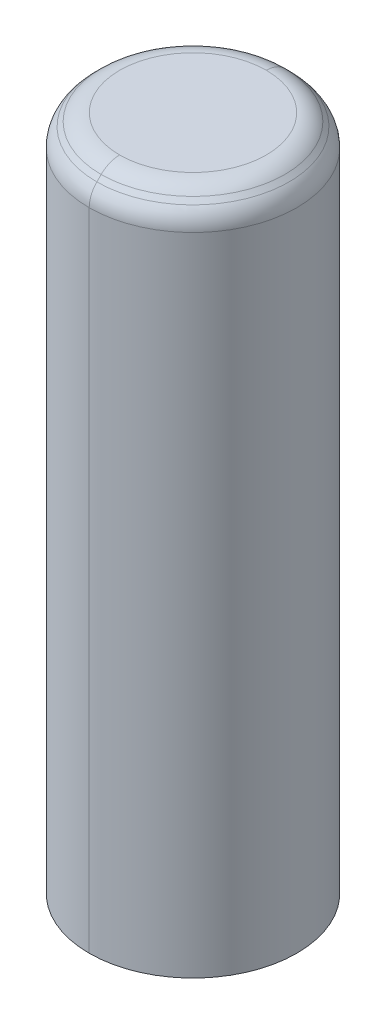
ISO-10303-21;
HEADER;
FILE_DESCRIPTION(('STEP AP214'),'2;1');
FILE_NAME('part.step','',(''),(''),'','','');
FILE_SCHEMA(('AUTOMOTIVE_DESIGN { 1 0 10303 214 1 1 1 1 }'));
ENDSEC;
DATA;
#1=APPLICATION_CONTEXT('core data for automotive mechanical design processes');
#2=APPLICATION_PROTOCOL_DEFINITION('international standard','automotive_design',2000,#1);
#3=PRODUCT_CONTEXT('',#1,'mechanical');
#4=PRODUCT('Part','Part','',(#3));
#5=PRODUCT_RELATED_PRODUCT_CATEGORY('part','',(#4));
#6=PRODUCT_DEFINITION_FORMATION('','',#4);
#7=PRODUCT_DEFINITION_CONTEXT('part definition',#1,'design');
#8=PRODUCT_DEFINITION('design','',#6,#7);
#9=PRODUCT_DEFINITION_SHAPE('','',#8);
#10=(LENGTH_UNIT() NAMED_UNIT(*) SI_UNIT(.MILLI.,.METRE.));
#11=(NAMED_UNIT(*) PLANE_ANGLE_UNIT() SI_UNIT($,.RADIAN.));
#12=(NAMED_UNIT(*) SI_UNIT($,.STERADIAN.) SOLID_ANGLE_UNIT());
#13=UNCERTAINTY_MEASURE_WITH_UNIT(LENGTH_MEASURE(1.E-05),#10,'distance_accuracy_value','');
#14=(GEOMETRIC_REPRESENTATION_CONTEXT(3) GLOBAL_UNCERTAINTY_ASSIGNED_CONTEXT((#13)) GLOBAL_UNIT_ASSIGNED_CONTEXT((#10,
#11,#12)) REPRESENTATION_CONTEXT('',''));
#15=CARTESIAN_POINT('',(0.,0.,0.));
#16=DIRECTION('',(0.,0.,1.));
#17=DIRECTION('',(1.,0.,0.));
#18=AXIS2_PLACEMENT_3D('',#15,#16,#17);
#19=CARTESIAN_POINT('',(0.,9.87431457505076,0.));
#20=DIRECTION('',(0.,1.,0.));
#21=DIRECTION('',(0.,0.,1.));
#22=AXIS2_PLACEMENT_3D('',#19,#20,#21);
#23=TOROIDAL_SURFACE('',#22,1.1875,0.4);
#24=CARTESIAN_POINT('',(0.,9.87431457505076,0.));
#25=DIRECTION('',(0.,-1.,0.));
#26=DIRECTION('',(0.,0.,1.));
#27=AXIS2_PLACEMENT_3D('',#24,#25,#26);
#28=CIRCLE('',#27,1.5875);
#29=CARTESIAN_POINT('',(0.,9.87431457505076,-1.5875));
#30=VERTEX_POINT('',#29);
#31=CARTESIAN_POINT('',(0.,9.87431457505076,1.5875));
#32=VERTEX_POINT('',#31);
#33=EDGE_CURVE('E140',#30,#32,#28,.T.);
#34=ORIENTED_EDGE('',*,*,#33,.F.);
#35=CARTESIAN_POINT('',(0.,9.87431457505076,-1.1875));
#36=DIRECTION('',(1.,0.,0.));
#37=DIRECTION('',(0.,0.,-1.));
#38=AXIS2_PLACEMENT_3D('',#35,#36,#37);
#39=CIRCLE('',#38,0.4);
#40=CARTESIAN_POINT('',(0.,10.1571572875254,-1.47034271247462));
#41=VERTEX_POINT('',#40);
#42=EDGE_CURVE('E11',#30,#41,#39,.T.);
#43=ORIENTED_EDGE('',*,*,#42,.T.);
#44=CARTESIAN_POINT('',(0.,10.1571572875254,0.));
#45=DIRECTION('',(0.,1.,0.));
#46=DIRECTION('',(0.,0.,-1.));
#47=AXIS2_PLACEMENT_3D('',#44,#45,#46);
#48=CIRCLE('',#47,1.47034271247462);
#49=CARTESIAN_POINT('',(0.,10.1571572875254,1.47034271247462));
#50=VERTEX_POINT('',#49);
#51=EDGE_CURVE('E150',#50,#41,#48,.T.);
#52=ORIENTED_EDGE('',*,*,#51,.F.);
#53=CARTESIAN_POINT('',(0.,9.87431457505076,1.1875));
#54=DIRECTION('',(-1.,0.,0.));
#55=DIRECTION('',(0.,0.,1.));
#56=AXIS2_PLACEMENT_3D('',#53,#54,#55);
#57=CIRCLE('',#56,0.4);
#58=EDGE_CURVE('E85',#32,#50,#57,.T.);
#59=ORIENTED_EDGE('',*,*,#58,.F.);
#60=EDGE_LOOP('',(#34,#43,#52,#59));
#61=FACE_BOUND('',#60,.T.);
#62=ADVANCED_FACE('F16',(#61),#23,.T.);
#63=CARTESIAN_POINT('',(0.,9.94,0.));
#64=DIRECTION('',(0.,1.,0.));
#65=DIRECTION('',(0.,0.,1.));
#66=AXIS2_PLACEMENT_3D('',#63,#64,#65);
#67=TOROIDAL_SURFACE('',#66,1.12181457505076,0.4);
#68=CARTESIAN_POINT('',(0.,10.2228427124746,0.));
#69=DIRECTION('',(0.,-1.,0.));
#70=DIRECTION('',(0.,0.,1.));
#71=AXIS2_PLACEMENT_3D('',#68,#69,#70);
#72=CIRCLE('',#71,1.40465728752538);
#73=CARTESIAN_POINT('',(0.,10.2228427124746,-1.40465728752538));
#74=VERTEX_POINT('',#73);
#75=CARTESIAN_POINT('',(0.,10.2228427124746,1.40465728752538));
#76=VERTEX_POINT('',#75);
#77=EDGE_CURVE('E147',#74,#76,#72,.T.);
#78=ORIENTED_EDGE('',*,*,#77,.F.);
#79=CARTESIAN_POINT('',(0.,9.94,-1.12181457505076));
#80=DIRECTION('',(1.,0.,0.));
#81=DIRECTION('',(0.,0.,-1.));
#82=AXIS2_PLACEMENT_3D('',#79,#80,#81);
#83=CIRCLE('',#82,0.4);
#84=CARTESIAN_POINT('',(0.,10.34,-1.12181457505076));
#85=VERTEX_POINT('',#84);
#86=EDGE_CURVE('E27',#74,#85,#83,.T.);
#87=ORIENTED_EDGE('',*,*,#86,.T.);
#88=CARTESIAN_POINT('',(0.,10.34,0.));
#89=DIRECTION('',(0.,1.,0.));
#90=DIRECTION('',(0.,0.,1.));
#91=AXIS2_PLACEMENT_3D('',#88,#89,#90);
#92=CIRCLE('',#91,1.12181457505076);
#93=CARTESIAN_POINT('',(0.,10.34,1.12181457505076));
#94=VERTEX_POINT('',#93);
#95=EDGE_CURVE('E103',#94,#85,#92,.T.);
#96=ORIENTED_EDGE('',*,*,#95,.F.);
#97=CARTESIAN_POINT('',(0.,9.94,1.12181457505076));
#98=DIRECTION('',(-1.,0.,0.));
#99=DIRECTION('',(0.,0.,1.));
#100=AXIS2_PLACEMENT_3D('',#97,#98,#99);
#101=CIRCLE('',#100,0.4);
#102=EDGE_CURVE('E20',#76,#94,#101,.T.);
#103=ORIENTED_EDGE('',*,*,#102,.F.);
#104=EDGE_LOOP('',(#78,#87,#96,#103));
#105=FACE_BOUND('',#104,.T.);
#106=ADVANCED_FACE('F18',(#105),#67,.T.);
#107=CARTESIAN_POINT('',(0.,10.34,0.));
#108=DIRECTION('',(0.,-1.,0.));
#109=DIRECTION('',(0.,0.,-1.));
#110=AXIS2_PLACEMENT_3D('',#107,#108,#109);
#111=CONICAL_SURFACE('',#110,1.2875,0.785398163397448);
#112=ORIENTED_EDGE('',*,*,#77,.T.);
#113=DIRECTION('',(0.,-0.707106781186548,0.707106781186547));
#114=VECTOR('',#113,1.);
#115=CARTESIAN_POINT('',(0.,10.34,1.2875));
#116=LINE('',#115,#114);
#117=EDGE_CURVE('E134',#76,#50,#116,.T.);
#118=ORIENTED_EDGE('',*,*,#117,.T.);
#119=ORIENTED_EDGE('',*,*,#51,.T.);
#120=DIRECTION('',(0.,-0.707106781186548,-0.707106781186547));
#121=VECTOR('',#120,1.);
#122=CARTESIAN_POINT('',(0.,10.34,-1.2875));
#123=LINE('',#122,#121);
#124=EDGE_CURVE('E94',#74,#41,#123,.T.);
#125=ORIENTED_EDGE('',*,*,#124,.F.);
#126=EDGE_LOOP('',(#112,#118,#119,#125));
#127=FACE_BOUND('',#126,.T.);
#128=ADVANCED_FACE('F163',(#127),#111,.T.);
#129=CARTESIAN_POINT('',(0.,10.34,0.));
#130=DIRECTION('',(0.,-1.,0.));
#131=DIRECTION('',(0.,0.,-1.));
#132=AXIS2_PLACEMENT_3D('',#129,#130,#131);
#133=CYLINDRICAL_SURFACE('',#132,1.5875);
#134=ORIENTED_EDGE('',*,*,#33,.T.);
#135=DIRECTION('',(0.,-1.,0.));
#136=VECTOR('',#135,1.);
#137=CARTESIAN_POINT('',(0.,10.34,1.5875));
#138=LINE('',#137,#136);
#139=CARTESIAN_POINT('',(0.,0.,1.5875));
#140=VERTEX_POINT('',#139);
#141=EDGE_CURVE('E138',#32,#140,#138,.T.);
#142=ORIENTED_EDGE('',*,*,#141,.T.);
#143=CARTESIAN_POINT('',(0.,0.,0.));
#144=DIRECTION('',(0.,1.,0.));
#145=DIRECTION('',(0.,0.,1.));
#146=AXIS2_PLACEMENT_3D('',#143,#144,#145);
#147=CIRCLE('',#146,1.5875);
#148=CARTESIAN_POINT('',(0.,0.,-1.5875));
#149=VERTEX_POINT('',#148);
#150=EDGE_CURVE('E64',#140,#149,#147,.T.);
#151=ORIENTED_EDGE('',*,*,#150,.T.);
#152=DIRECTION('',(0.,-1.,0.));
#153=VECTOR('',#152,1.);
#154=CARTESIAN_POINT('',(0.,10.34,-1.5875));
#155=LINE('',#154,#153);
#156=EDGE_CURVE('E42',#30,#149,#155,.T.);
#157=ORIENTED_EDGE('',*,*,#156,.F.);
#158=EDGE_LOOP('',(#134,#142,#151,#157));
#159=FACE_BOUND('',#158,.T.);
#160=ADVANCED_FACE('F177',(#159),#133,.T.);
#161=CARTESIAN_POINT('',(0.,10.34,0.));
#162=DIRECTION('',(0.,-1.,0.));
#163=DIRECTION('',(0.,0.,-1.));
#164=AXIS2_PLACEMENT_3D('',#161,#162,#163);
#165=CYLINDRICAL_SURFACE('',#164,1.5875);
#166=ORIENTED_EDGE('',*,*,#141,.F.);
#167=CARTESIAN_POINT('',(0.,9.87431457505076,0.));
#168=DIRECTION('',(0.,-1.,0.));
#169=DIRECTION('',(0.,0.,1.));
#170=AXIS2_PLACEMENT_3D('',#167,#168,#169);
#171=CIRCLE('',#170,1.5875);
#172=EDGE_CURVE('E146',#32,#30,#171,.T.);
#173=ORIENTED_EDGE('',*,*,#172,.T.);
#174=ORIENTED_EDGE('',*,*,#156,.T.);
#175=CARTESIAN_POINT('',(0.,0.,0.));
#176=DIRECTION('',(0.,1.,0.));
#177=DIRECTION('',(0.,0.,1.));
#178=AXIS2_PLACEMENT_3D('',#175,#176,#177);
#179=CIRCLE('',#178,1.5875);
#180=EDGE_CURVE('E121',#149,#140,#179,.T.);
#181=ORIENTED_EDGE('',*,*,#180,.T.);
#182=EDGE_LOOP('',(#166,#173,#174,#181));
#183=FACE_BOUND('',#182,.T.);
#184=ADVANCED_FACE('F178',(#183),#165,.T.);
#185=CARTESIAN_POINT('',(0.,10.34,0.));
#186=DIRECTION('',(0.,1.,0.));
#187=DIRECTION('',(1.,0.,0.));
#188=AXIS2_PLACEMENT_3D('',#185,#186,#187);
#189=PLANE('',#188);
#190=ORIENTED_EDGE('',*,*,#95,.T.);
#191=CARTESIAN_POINT('',(0.,10.34,0.));
#192=DIRECTION('',(0.,1.,0.));
#193=DIRECTION('',(0.,0.,1.));
#194=AXIS2_PLACEMENT_3D('',#191,#192,#193);
#195=CIRCLE('',#194,1.12181457505076);
#196=EDGE_CURVE('E113',#85,#94,#195,.T.);
#197=ORIENTED_EDGE('',*,*,#196,.T.);
#198=EDGE_LOOP('',(#190,#197));
#199=FACE_BOUND('',#198,.T.);
#200=ADVANCED_FACE('F123',(#199),#189,.T.);
#201=CARTESIAN_POINT('',(0.,0.,0.));
#202=DIRECTION('',(0.,1.,0.));
#203=DIRECTION('',(1.,0.,0.));
#204=AXIS2_PLACEMENT_3D('',#201,#202,#203);
#205=PLANE('',#204);
#206=ORIENTED_EDGE('',*,*,#180,.F.);
#207=ORIENTED_EDGE('',*,*,#150,.F.);
#208=EDGE_LOOP('',(#206,#207));
#209=FACE_BOUND('',#208,.T.);
#210=ADVANCED_FACE('F179',(#209),#205,.F.);
#211=CARTESIAN_POINT('',(0.,10.34,0.));
#212=DIRECTION('',(0.,-1.,0.));
#213=DIRECTION('',(0.,0.,-1.));
#214=AXIS2_PLACEMENT_3D('',#211,#212,#213);
#215=CONICAL_SURFACE('',#214,1.2875,0.785398163397448);
#216=ORIENTED_EDGE('',*,*,#117,.F.);
#217=CARTESIAN_POINT('',(0.,10.2228427124746,0.));
#218=DIRECTION('',(0.,-1.,0.));
#219=DIRECTION('',(0.,0.,1.));
#220=AXIS2_PLACEMENT_3D('',#217,#218,#219);
#221=CIRCLE('',#220,1.40465728752538);
#222=EDGE_CURVE('E115',#76,#74,#221,.T.);
#223=ORIENTED_EDGE('',*,*,#222,.T.);
#224=ORIENTED_EDGE('',*,*,#124,.T.);
#225=CARTESIAN_POINT('',(0.,10.1571572875254,0.));
#226=DIRECTION('',(0.,1.,0.));
#227=DIRECTION('',(0.,0.,-1.));
#228=AXIS2_PLACEMENT_3D('',#225,#226,#227);
#229=CIRCLE('',#228,1.47034271247462);
#230=EDGE_CURVE('E119',#41,#50,#229,.T.);
#231=ORIENTED_EDGE('',*,*,#230,.T.);
#232=EDGE_LOOP('',(#216,#223,#224,#231));
#233=FACE_BOUND('',#232,.T.);
#234=ADVANCED_FACE('F160',(#233),#215,.T.);
#235=CARTESIAN_POINT('',(0.,9.94,0.));
#236=DIRECTION('',(0.,1.,0.));
#237=DIRECTION('',(0.,0.,1.));
#238=AXIS2_PLACEMENT_3D('',#235,#236,#237);
#239=TOROIDAL_SURFACE('',#238,1.12181457505076,0.4);
#240=ORIENTED_EDGE('',*,*,#86,.F.);
#241=ORIENTED_EDGE('',*,*,#222,.F.);
#242=ORIENTED_EDGE('',*,*,#102,.T.);
#243=ORIENTED_EDGE('',*,*,#196,.F.);
#244=EDGE_LOOP('',(#240,#241,#242,#243));
#245=FACE_BOUND('',#244,.T.);
#246=ADVANCED_FACE('F112',(#245),#239,.T.);
#247=CARTESIAN_POINT('',(0.,9.87431457505076,0.));
#248=DIRECTION('',(0.,1.,0.));
#249=DIRECTION('',(0.,0.,1.));
#250=AXIS2_PLACEMENT_3D('',#247,#248,#249);
#251=TOROIDAL_SURFACE('',#250,1.1875,0.4);
#252=ORIENTED_EDGE('',*,*,#42,.F.);
#253=ORIENTED_EDGE('',*,*,#172,.F.);
#254=ORIENTED_EDGE('',*,*,#58,.T.);
#255=ORIENTED_EDGE('',*,*,#230,.F.);
#256=EDGE_LOOP('',(#252,#253,#254,#255));
#257=FACE_BOUND('',#256,.T.);
#258=ADVANCED_FACE('F167',(#257),#251,.T.);
#259=CLOSED_SHELL('',(#62,#106,#128,#160,#184,#200,#210,#234,#246,#258));
#260=MANIFOLD_SOLID_BREP('B1',#259);
#261=ADVANCED_BREP_SHAPE_REPRESENTATION('',(#18,#260),#14);
#262=SHAPE_DEFINITION_REPRESENTATION(#9,#261);
ENDSEC;
END-ISO-10303-21;
